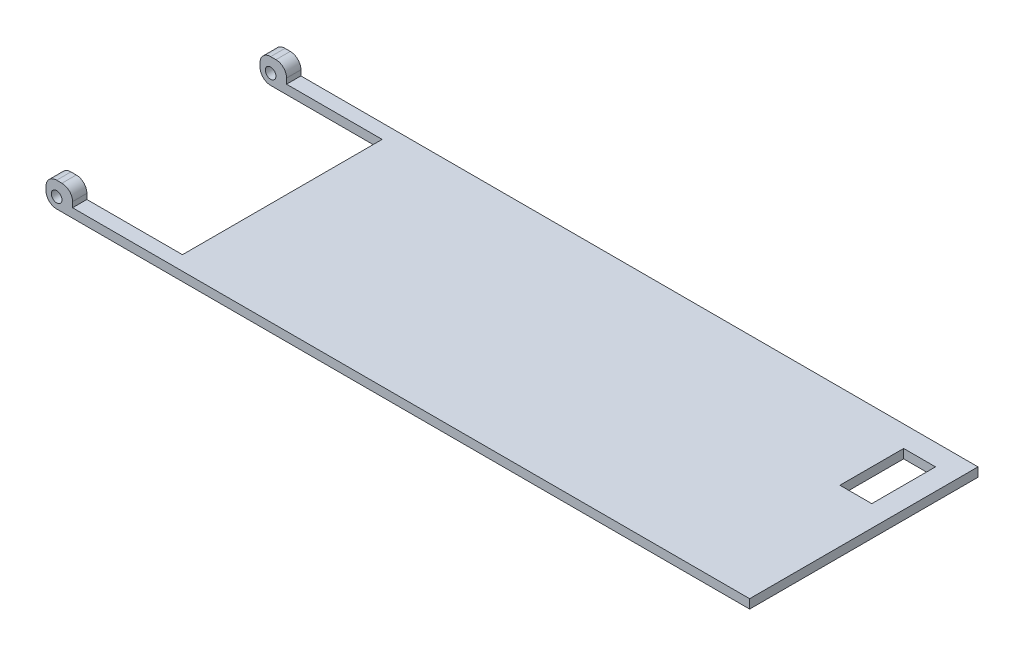
ISO-10303-21;
HEADER;
FILE_DESCRIPTION(('STEP AP214'),'2;1');
FILE_NAME('part.step','',(''),(''),'','','');
FILE_SCHEMA(('AUTOMOTIVE_DESIGN { 1 0 10303 214 1 1 1 1 }'));
ENDSEC;
DATA;
#1=APPLICATION_CONTEXT('core data for automotive mechanical design processes');
#2=APPLICATION_PROTOCOL_DEFINITION('international standard','automotive_design',2000,#1);
#3=PRODUCT_CONTEXT('',#1,'mechanical');
#4=PRODUCT('Part','Part','',(#3));
#5=PRODUCT_RELATED_PRODUCT_CATEGORY('part','',(#4));
#6=PRODUCT_DEFINITION_FORMATION('','',#4);
#7=PRODUCT_DEFINITION_CONTEXT('part definition',#1,'design');
#8=PRODUCT_DEFINITION('design','',#6,#7);
#9=PRODUCT_DEFINITION_SHAPE('','',#8);
#10=(LENGTH_UNIT() NAMED_UNIT(*) SI_UNIT(.MILLI.,.METRE.));
#11=(NAMED_UNIT(*) PLANE_ANGLE_UNIT() SI_UNIT($,.RADIAN.));
#12=(NAMED_UNIT(*) SI_UNIT($,.STERADIAN.) SOLID_ANGLE_UNIT());
#13=UNCERTAINTY_MEASURE_WITH_UNIT(LENGTH_MEASURE(1.E-05),#10,'distance_accuracy_value','');
#14=(GEOMETRIC_REPRESENTATION_CONTEXT(3) GLOBAL_UNCERTAINTY_ASSIGNED_CONTEXT((#13)) GLOBAL_UNIT_ASSIGNED_CONTEXT((#10,
#11,#12)) REPRESENTATION_CONTEXT('',''));
#15=CARTESIAN_POINT('',(0.,0.,0.));
#16=DIRECTION('',(0.,0.,1.));
#17=DIRECTION('',(1.,0.,0.));
#18=AXIS2_PLACEMENT_3D('',#15,#16,#17);
#19=CARTESIAN_POINT('',(0.,1.7,0.));
#20=DIRECTION('',(0.,-1.,0.));
#21=DIRECTION('',(0.,0.,-1.));
#22=AXIS2_PLACEMENT_3D('',#19,#20,#21);
#23=PLANE('',#22);
#24=DIRECTION('',(-1.,0.,0.));
#25=VECTOR('',#24,1.);
#26=CARTESIAN_POINT('',(56.25,1.7,-17.5));
#27=LINE('',#26,#25);
#28=CARTESIAN_POINT('',(62.25,1.7,-17.5));
#29=VERTEX_POINT('',#28);
#30=CARTESIAN_POINT('',(56.25,1.7,-17.5));
#31=VERTEX_POINT('',#30);
#32=EDGE_CURVE('E228',#29,#31,#27,.T.);
#33=ORIENTED_EDGE('',*,*,#32,.F.);
#34=DIRECTION('',(0.,0.,-1.));
#35=VECTOR('',#34,1.);
#36=CARTESIAN_POINT('',(62.25,1.7,-5.5));
#37=LINE('',#36,#35);
#38=CARTESIAN_POINT('',(62.25,1.7,-5.5));
#39=VERTEX_POINT('',#38);
#40=EDGE_CURVE('E61',#39,#29,#37,.T.);
#41=ORIENTED_EDGE('',*,*,#40,.F.);
#42=DIRECTION('',(1.,0.,0.));
#43=VECTOR('',#42,1.);
#44=CARTESIAN_POINT('',(56.25,1.7,-5.5));
#45=LINE('',#44,#43);
#46=CARTESIAN_POINT('',(56.25,1.7,-5.5));
#47=VERTEX_POINT('',#46);
#48=EDGE_CURVE('E215',#47,#39,#45,.T.);
#49=ORIENTED_EDGE('',*,*,#48,.F.);
#50=DIRECTION('',(0.,0.,1.));
#51=VECTOR('',#50,1.);
#52=CARTESIAN_POINT('',(56.25,1.7,-5.5));
#53=LINE('',#52,#51);
#54=EDGE_CURVE('E219',#31,#47,#53,.T.);
#55=ORIENTED_EDGE('',*,*,#54,.F.);
#56=EDGE_LOOP('',(#33,#41,#49,#55));
#57=FACE_BOUND('',#56,.T.);
#58=DIRECTION('',(-1.,0.,0.));
#59=VECTOR('',#58,1.);
#60=CARTESIAN_POINT('',(-66.25,1.7,-21.5));
#61=LINE('',#60,#59);
#62=CARTESIAN_POINT('',(66.25,1.7,-21.5));
#63=VERTEX_POINT('',#62);
#64=CARTESIAN_POINT('',(-61.25,1.7,-21.5));
#65=VERTEX_POINT('',#64);
#66=EDGE_CURVE('E336',#63,#65,#61,.T.);
#67=ORIENTED_EDGE('',*,*,#66,.T.);
#68=DIRECTION('',(0.,0.,1.));
#69=VECTOR('',#68,1.);
#70=CARTESIAN_POINT('',(-61.25,1.7,-18.8));
#71=LINE('',#70,#69);
#72=CARTESIAN_POINT('',(-61.25,1.7,-18.8));
#73=VERTEX_POINT('',#72);
#74=EDGE_CURVE('E247',#65,#73,#71,.T.);
#75=ORIENTED_EDGE('',*,*,#74,.T.);
#76=DIRECTION('',(-1.,0.,0.));
#77=VECTOR('',#76,1.);
#78=CARTESIAN_POINT('',(-66.25,1.7,-18.8));
#79=LINE('',#78,#77);
#80=CARTESIAN_POINT('',(-43.25,1.7,-18.8));
#81=VERTEX_POINT('',#80);
#82=EDGE_CURVE('E299',#81,#73,#79,.T.);
#83=ORIENTED_EDGE('',*,*,#82,.F.);
#84=DIRECTION('',(0.,0.,-1.));
#85=VECTOR('',#84,1.);
#86=CARTESIAN_POINT('',(-43.25,1.7,18.8));
#87=LINE('',#86,#85);
#88=CARTESIAN_POINT('',(-43.25,1.7,18.8));
#89=VERTEX_POINT('',#88);
#90=EDGE_CURVE('E310',#89,#81,#87,.T.);
#91=ORIENTED_EDGE('',*,*,#90,.F.);
#92=DIRECTION('',(1.,0.,0.));
#93=VECTOR('',#92,1.);
#94=CARTESIAN_POINT('',(-66.25,1.7,18.8));
#95=LINE('',#94,#93);
#96=CARTESIAN_POINT('',(-61.25,1.7,18.8));
#97=VERTEX_POINT('',#96);
#98=EDGE_CURVE('E294',#97,#89,#95,.T.);
#99=ORIENTED_EDGE('',*,*,#98,.F.);
#100=DIRECTION('',(0.,0.,-1.));
#101=VECTOR('',#100,1.);
#102=CARTESIAN_POINT('',(-61.25,1.7,18.8));
#103=LINE('',#102,#101);
#104=CARTESIAN_POINT('',(-61.25,1.7,21.5));
#105=VERTEX_POINT('',#104);
#106=EDGE_CURVE('E273',#105,#97,#103,.T.);
#107=ORIENTED_EDGE('',*,*,#106,.F.);
#108=DIRECTION('',(1.,0.,0.));
#109=VECTOR('',#108,1.);
#110=CARTESIAN_POINT('',(-66.25,1.7,21.5));
#111=LINE('',#110,#109);
#112=CARTESIAN_POINT('',(66.25,1.7,21.5));
#113=VERTEX_POINT('',#112);
#114=EDGE_CURVE('E341',#105,#113,#111,.T.);
#115=ORIENTED_EDGE('',*,*,#114,.T.);
#116=DIRECTION('',(0.,0.,-1.));
#117=VECTOR('',#116,1.);
#118=CARTESIAN_POINT('',(66.25,1.7,21.5));
#119=LINE('',#118,#117);
#120=EDGE_CURVE('E332',#113,#63,#119,.T.);
#121=ORIENTED_EDGE('',*,*,#120,.T.);
#122=EDGE_LOOP('',(#67,#75,#83,#91,#99,#107,#115,#121));
#123=FACE_BOUND('',#122,.T.);
#124=ADVANCED_FACE('F45',(#57,#123),#23,.F.);
#125=CARTESIAN_POINT('',(-66.25,1.7,21.5));
#126=DIRECTION('',(1.,0.,0.));
#127=DIRECTION('',(0.,0.,-1.));
#128=AXIS2_PLACEMENT_3D('',#125,#126,#127);
#129=PLANE('',#128);
#130=DIRECTION('',(0.,-1.,0.));
#131=VECTOR('',#130,1.);
#132=CARTESIAN_POINT('',(-66.25,1.7,-21.5));
#133=LINE('',#132,#131);
#134=CARTESIAN_POINT('',(-66.25,2.7,-21.5));
#135=VERTEX_POINT('',#134);
#136=CARTESIAN_POINT('',(-66.25,2.,-21.5));
#137=VERTEX_POINT('',#136);
#138=EDGE_CURVE('E361',#135,#137,#133,.T.);
#139=ORIENTED_EDGE('',*,*,#138,.T.);
#140=DIRECTION('',(0.,0.,1.));
#141=VECTOR('',#140,1.);
#142=CARTESIAN_POINT('',(-66.25,2.,-18.8));
#143=LINE('',#142,#141);
#144=CARTESIAN_POINT('',(-66.25,2.,-18.8));
#145=VERTEX_POINT('',#144);
#146=EDGE_CURVE('E412',#137,#145,#143,.T.);
#147=ORIENTED_EDGE('',*,*,#146,.T.);
#148=DIRECTION('',(0.,1.,0.));
#149=VECTOR('',#148,1.);
#150=CARTESIAN_POINT('',(-66.25,0.,-18.8));
#151=LINE('',#150,#149);
#152=CARTESIAN_POINT('',(-66.25,2.7,-18.8));
#153=VERTEX_POINT('',#152);
#154=EDGE_CURVE('E317',#145,#153,#151,.T.);
#155=ORIENTED_EDGE('',*,*,#154,.T.);
#156=DIRECTION('',(0.,0.,-1.));
#157=VECTOR('',#156,1.);
#158=CARTESIAN_POINT('',(-66.25,2.7,-21.5));
#159=LINE('',#158,#157);
#160=EDGE_CURVE('E408',#153,#135,#159,.T.);
#161=ORIENTED_EDGE('',*,*,#160,.T.);
#162=EDGE_LOOP('',(#139,#147,#155,#161));
#163=FACE_BOUND('',#162,.T.);
#164=ADVANCED_FACE('F456',(#163),#129,.F.);
#165=CARTESIAN_POINT('',(66.25,1.7,21.5));
#166=DIRECTION('',(-1.,0.,0.));
#167=DIRECTION('',(0.,0.,1.));
#168=AXIS2_PLACEMENT_3D('',#165,#166,#167);
#169=PLANE('',#168);
#170=DIRECTION('',(0.,0.,-1.));
#171=VECTOR('',#170,1.);
#172=CARTESIAN_POINT('',(66.25,0.,21.5));
#173=LINE('',#172,#171);
#174=CARTESIAN_POINT('',(66.25,0.,21.5));
#175=VERTEX_POINT('',#174);
#176=CARTESIAN_POINT('',(66.25,0.,-21.5));
#177=VERTEX_POINT('',#176);
#178=EDGE_CURVE('E321',#175,#177,#173,.T.);
#179=ORIENTED_EDGE('',*,*,#178,.T.);
#180=DIRECTION('',(0.,-1.,0.));
#181=VECTOR('',#180,1.);
#182=CARTESIAN_POINT('',(66.25,1.7,-21.5));
#183=LINE('',#182,#181);
#184=EDGE_CURVE('E365',#63,#177,#183,.T.);
#185=ORIENTED_EDGE('',*,*,#184,.F.);
#186=ORIENTED_EDGE('',*,*,#120,.F.);
#187=DIRECTION('',(0.,-1.,0.));
#188=VECTOR('',#187,1.);
#189=CARTESIAN_POINT('',(66.25,1.7,21.5));
#190=LINE('',#189,#188);
#191=EDGE_CURVE('E344',#113,#175,#190,.T.);
#192=ORIENTED_EDGE('',*,*,#191,.T.);
#193=EDGE_LOOP('',(#179,#185,#186,#192));
#194=FACE_BOUND('',#193,.T.);
#195=ADVANCED_FACE('F512',(#194),#169,.F.);
#196=CARTESIAN_POINT('',(-66.25,1.7,-21.5));
#197=DIRECTION('',(0.,0.,1.));
#198=DIRECTION('',(1.,0.,0.));
#199=AXIS2_PLACEMENT_3D('',#196,#197,#198);
#200=PLANE('',#199);
#201=CARTESIAN_POINT('',(-64.25,2.,-21.5));
#202=DIRECTION('',(0.,0.,1.));
#203=DIRECTION('',(1.,0.,0.));
#204=AXIS2_PLACEMENT_3D('',#201,#202,#203);
#205=CIRCLE('',#204,0.999999999999998);
#206=CARTESIAN_POINT('',(-65.25,2.,-21.5));
#207=VERTEX_POINT('',#206);
#208=EDGE_CURVE('E237',#207,#207,#205,.T.);
#209=ORIENTED_EDGE('',*,*,#208,.T.);
#210=EDGE_LOOP('',(#209));
#211=FACE_BOUND('',#210,.T.);
#212=DIRECTION('',(-1.,0.,0.));
#213=VECTOR('',#212,1.);
#214=CARTESIAN_POINT('',(-66.25,0.,-21.5));
#215=LINE('',#214,#213);
#216=CARTESIAN_POINT('',(-64.25,0.,-21.5));
#217=VERTEX_POINT('',#216);
#218=EDGE_CURVE('E348',#177,#217,#215,.T.);
#219=ORIENTED_EDGE('',*,*,#218,.T.);
#220=CARTESIAN_POINT('',(-64.25,2.,-21.5));
#221=DIRECTION('',(0.,0.,1.));
#222=DIRECTION('',(1.,0.,0.));
#223=AXIS2_PLACEMENT_3D('',#220,#221,#222);
#224=CIRCLE('',#223,2.);
#225=EDGE_CURVE('E434',#217,#137,#224,.F.);
#226=ORIENTED_EDGE('',*,*,#225,.T.);
#227=ORIENTED_EDGE('',*,*,#138,.F.);
#228=CARTESIAN_POINT('',(-64.25,2.7,-21.5));
#229=DIRECTION('',(0.,0.,1.));
#230=DIRECTION('',(1.,0.,0.));
#231=AXIS2_PLACEMENT_3D('',#228,#229,#230);
#232=CIRCLE('',#231,2.);
#233=CARTESIAN_POINT('',(-64.25,4.7,-21.5));
#234=VERTEX_POINT('',#233);
#235=EDGE_CURVE('E428',#135,#234,#232,.F.);
#236=ORIENTED_EDGE('',*,*,#235,.T.);
#237=DIRECTION('',(1.,0.,0.));
#238=VECTOR('',#237,1.);
#239=CARTESIAN_POINT('',(-66.25,4.7,-21.5));
#240=LINE('',#239,#238);
#241=CARTESIAN_POINT('',(-63.25,4.7,-21.5));
#242=VERTEX_POINT('',#241);
#243=EDGE_CURVE('E255',#234,#242,#240,.T.);
#244=ORIENTED_EDGE('',*,*,#243,.T.);
#245=CARTESIAN_POINT('',(-63.25,2.7,-21.5));
#246=DIRECTION('',(0.,0.,1.));
#247=DIRECTION('',(1.,0.,0.));
#248=AXIS2_PLACEMENT_3D('',#245,#246,#247);
#249=CIRCLE('',#248,2.);
#250=CARTESIAN_POINT('',(-61.25,2.7,-21.5));
#251=VERTEX_POINT('',#250);
#252=EDGE_CURVE('E431',#242,#251,#249,.F.);
#253=ORIENTED_EDGE('',*,*,#252,.T.);
#254=DIRECTION('',(0.,-1.,0.));
#255=VECTOR('',#254,1.);
#256=CARTESIAN_POINT('',(-61.25,4.7,-21.5));
#257=LINE('',#256,#255);
#258=EDGE_CURVE('E259',#251,#65,#257,.T.);
#259=ORIENTED_EDGE('',*,*,#258,.T.);
#260=ORIENTED_EDGE('',*,*,#66,.F.);
#261=ORIENTED_EDGE('',*,*,#184,.T.);
#262=EDGE_LOOP('',(#219,#226,#227,#236,#244,#253,#259,#260,#261));
#263=FACE_BOUND('',#262,.T.);
#264=ADVANCED_FACE('F459',(#211,#263),#200,.F.);
#265=DIRECTION('',(0.,1.,0.));
#266=VECTOR('',#265,1.);
#267=CARTESIAN_POINT('',(-66.25,0.,18.8));
#268=LINE('',#267,#266);
#269=CARTESIAN_POINT('',(-66.25,2.,18.8));
#270=VERTEX_POINT('',#269);
#271=CARTESIAN_POINT('',(-66.25,2.7,18.8));
#272=VERTEX_POINT('',#271);
#273=EDGE_CURVE('E307',#270,#272,#268,.T.);
#274=ORIENTED_EDGE('',*,*,#273,.F.);
#275=DIRECTION('',(0.,0.,1.));
#276=VECTOR('',#275,1.);
#277=CARTESIAN_POINT('',(-66.25,2.,21.5));
#278=LINE('',#277,#276);
#279=CARTESIAN_POINT('',(-66.25,2.,21.5));
#280=VERTEX_POINT('',#279);
#281=EDGE_CURVE('E372',#270,#280,#278,.T.);
#282=ORIENTED_EDGE('',*,*,#281,.T.);
#283=DIRECTION('',(0.,-1.,0.));
#284=VECTOR('',#283,1.);
#285=CARTESIAN_POINT('',(-66.25,1.7,21.5));
#286=LINE('',#285,#284);
#287=CARTESIAN_POINT('',(-66.25,2.7,21.5));
#288=VERTEX_POINT('',#287);
#289=EDGE_CURVE('E357',#288,#280,#286,.T.);
#290=ORIENTED_EDGE('',*,*,#289,.F.);
#291=DIRECTION('',(0.,0.,1.));
#292=VECTOR('',#291,1.);
#293=CARTESIAN_POINT('',(-66.25,2.7,18.8));
#294=LINE('',#293,#292);
#295=EDGE_CURVE('E369',#288,#272,#294,.F.);
#296=ORIENTED_EDGE('',*,*,#295,.T.);
#297=EDGE_LOOP('',(#274,#282,#290,#296));
#298=FACE_BOUND('',#297,.T.);
#299=ADVANCED_FACE('F503',(#298),#129,.F.);
#300=CARTESIAN_POINT('',(-66.25,1.7,21.5));
#301=DIRECTION('',(0.,0.,-1.));
#302=DIRECTION('',(-1.,0.,0.));
#303=AXIS2_PLACEMENT_3D('',#300,#301,#302);
#304=PLANE('',#303);
#305=CARTESIAN_POINT('',(-64.25,2.,21.5));
#306=DIRECTION('',(0.,0.,1.));
#307=DIRECTION('',(1.,0.,0.));
#308=AXIS2_PLACEMENT_3D('',#305,#306,#307);
#309=CIRCLE('',#308,0.999999999999998);
#310=CARTESIAN_POINT('',(-63.25,2.,21.5));
#311=VERTEX_POINT('',#310);
#312=EDGE_CURVE('E268',#311,#311,#309,.T.);
#313=ORIENTED_EDGE('',*,*,#312,.F.);
#314=EDGE_LOOP('',(#313));
#315=FACE_BOUND('',#314,.T.);
#316=ORIENTED_EDGE('',*,*,#289,.T.);
#317=CARTESIAN_POINT('',(-64.25,2.,21.5));
#318=DIRECTION('',(0.,0.,-1.));
#319=DIRECTION('',(-1.,0.,0.));
#320=AXIS2_PLACEMENT_3D('',#317,#318,#319);
#321=CIRCLE('',#320,2.);
#322=CARTESIAN_POINT('',(-64.25,0.,21.5));
#323=VERTEX_POINT('',#322);
#324=EDGE_CURVE('E382',#280,#323,#321,.F.);
#325=ORIENTED_EDGE('',*,*,#324,.T.);
#326=DIRECTION('',(1.,0.,0.));
#327=VECTOR('',#326,1.);
#328=CARTESIAN_POINT('',(-66.25,0.,21.5));
#329=LINE('',#328,#327);
#330=EDGE_CURVE('E337',#323,#175,#329,.T.);
#331=ORIENTED_EDGE('',*,*,#330,.T.);
#332=ORIENTED_EDGE('',*,*,#191,.F.);
#333=ORIENTED_EDGE('',*,*,#114,.F.);
#334=DIRECTION('',(0.,-1.,0.));
#335=VECTOR('',#334,1.);
#336=CARTESIAN_POINT('',(-61.25,4.7,21.5));
#337=LINE('',#336,#335);
#338=CARTESIAN_POINT('',(-61.25,2.7,21.5));
#339=VERTEX_POINT('',#338);
#340=EDGE_CURVE('E291',#339,#105,#337,.T.);
#341=ORIENTED_EDGE('',*,*,#340,.F.);
#342=CARTESIAN_POINT('',(-63.25,2.7,21.5));
#343=DIRECTION('',(0.,0.,-1.));
#344=DIRECTION('',(-1.,0.,0.));
#345=AXIS2_PLACEMENT_3D('',#342,#343,#344);
#346=CIRCLE('',#345,2.);
#347=CARTESIAN_POINT('',(-63.25,4.7,21.5));
#348=VERTEX_POINT('',#347);
#349=EDGE_CURVE('E379',#339,#348,#346,.F.);
#350=ORIENTED_EDGE('',*,*,#349,.T.);
#351=DIRECTION('',(1.,0.,0.));
#352=VECTOR('',#351,1.);
#353=CARTESIAN_POINT('',(-66.25,4.7,21.5));
#354=LINE('',#353,#352);
#355=CARTESIAN_POINT('',(-64.25,4.7,21.5));
#356=VERTEX_POINT('',#355);
#357=EDGE_CURVE('E277',#356,#348,#354,.T.);
#358=ORIENTED_EDGE('',*,*,#357,.F.);
#359=CARTESIAN_POINT('',(-64.25,2.7,21.5));
#360=DIRECTION('',(0.,0.,-1.));
#361=DIRECTION('',(-1.,0.,0.));
#362=AXIS2_PLACEMENT_3D('',#359,#360,#361);
#363=CIRCLE('',#362,2.);
#364=EDGE_CURVE('E376',#356,#288,#363,.F.);
#365=ORIENTED_EDGE('',*,*,#364,.T.);
#366=EDGE_LOOP('',(#316,#325,#331,#332,#333,#341,#350,#358,#365));
#367=FACE_BOUND('',#366,.T.);
#368=ADVANCED_FACE('F486',(#315,#367),#304,.F.);
#369=CARTESIAN_POINT('',(0.,0.,0.));
#370=DIRECTION('',(0.,-1.,0.));
#371=DIRECTION('',(0.,0.,-1.));
#372=AXIS2_PLACEMENT_3D('',#369,#370,#371);
#373=PLANE('',#372);
#374=DIRECTION('',(0.,0.,-1.));
#375=VECTOR('',#374,1.);
#376=CARTESIAN_POINT('',(62.25,0.,-5.5));
#377=LINE('',#376,#375);
#378=CARTESIAN_POINT('',(62.25,0.,-5.5));
#379=VERTEX_POINT('',#378);
#380=CARTESIAN_POINT('',(62.25,0.,-17.5));
#381=VERTEX_POINT('',#380);
#382=EDGE_CURVE('E196',#379,#381,#377,.T.);
#383=ORIENTED_EDGE('',*,*,#382,.T.);
#384=DIRECTION('',(-1.,0.,0.));
#385=VECTOR('',#384,1.);
#386=CARTESIAN_POINT('',(56.25,0.,-17.5));
#387=LINE('',#386,#385);
#388=CARTESIAN_POINT('',(56.25,0.,-17.5));
#389=VERTEX_POINT('',#388);
#390=EDGE_CURVE('E206',#381,#389,#387,.T.);
#391=ORIENTED_EDGE('',*,*,#390,.T.);
#392=DIRECTION('',(0.,0.,1.));
#393=VECTOR('',#392,1.);
#394=CARTESIAN_POINT('',(56.25,0.,-5.5));
#395=LINE('',#394,#393);
#396=CARTESIAN_POINT('',(56.25,0.,-5.5));
#397=VERTEX_POINT('',#396);
#398=EDGE_CURVE('E69',#389,#397,#395,.T.);
#399=ORIENTED_EDGE('',*,*,#398,.T.);
#400=DIRECTION('',(1.,0.,0.));
#401=VECTOR('',#400,1.);
#402=CARTESIAN_POINT('',(56.25,0.,-5.5));
#403=LINE('',#402,#401);
#404=EDGE_CURVE('E203',#397,#379,#403,.T.);
#405=ORIENTED_EDGE('',*,*,#404,.T.);
#406=EDGE_LOOP('',(#383,#391,#399,#405));
#407=FACE_BOUND('',#406,.T.);
#408=DIRECTION('',(-1.,0.,0.));
#409=VECTOR('',#408,1.);
#410=CARTESIAN_POINT('',(-66.25,0.,-18.8));
#411=LINE('',#410,#409);
#412=CARTESIAN_POINT('',(-43.25,0.,-18.8));
#413=VERTEX_POINT('',#412);
#414=CARTESIAN_POINT('',(-64.25,0.,-18.8));
#415=VERTEX_POINT('',#414);
#416=EDGE_CURVE('E303',#413,#415,#411,.T.);
#417=ORIENTED_EDGE('',*,*,#416,.T.);
#418=DIRECTION('',(0.,0.,1.));
#419=VECTOR('',#418,1.);
#420=CARTESIAN_POINT('',(-64.25,0.,-21.5));
#421=LINE('',#420,#419);
#422=EDGE_CURVE('E425',#415,#217,#421,.F.);
#423=ORIENTED_EDGE('',*,*,#422,.T.);
#424=ORIENTED_EDGE('',*,*,#218,.F.);
#425=ORIENTED_EDGE('',*,*,#178,.F.);
#426=ORIENTED_EDGE('',*,*,#330,.F.);
#427=DIRECTION('',(0.,0.,1.));
#428=VECTOR('',#427,1.);
#429=CARTESIAN_POINT('',(-64.25,0.,18.8));
#430=LINE('',#429,#428);
#431=CARTESIAN_POINT('',(-64.25,0.,18.8));
#432=VERTEX_POINT('',#431);
#433=EDGE_CURVE('E385',#323,#432,#430,.F.);
#434=ORIENTED_EDGE('',*,*,#433,.T.);
#435=DIRECTION('',(1.,0.,0.));
#436=VECTOR('',#435,1.);
#437=CARTESIAN_POINT('',(-66.25,0.,18.8));
#438=LINE('',#437,#436);
#439=CARTESIAN_POINT('',(-43.25,0.,18.8));
#440=VERTEX_POINT('',#439);
#441=EDGE_CURVE('E295',#432,#440,#438,.T.);
#442=ORIENTED_EDGE('',*,*,#441,.T.);
#443=DIRECTION('',(0.,0.,-1.));
#444=VECTOR('',#443,1.);
#445=CARTESIAN_POINT('',(-43.25,0.,18.8));
#446=LINE('',#445,#444);
#447=EDGE_CURVE('E298',#440,#413,#446,.T.);
#448=ORIENTED_EDGE('',*,*,#447,.T.);
#449=EDGE_LOOP('',(#417,#423,#424,#425,#426,#434,#442,#448));
#450=FACE_BOUND('',#449,.T.);
#451=ADVANCED_FACE('F211',(#407,#450),#373,.T.);
#452=CARTESIAN_POINT('',(-66.25,0.,-18.8));
#453=DIRECTION('',(0.,0.,-1.));
#454=DIRECTION('',(-1.,0.,0.));
#455=AXIS2_PLACEMENT_3D('',#452,#453,#454);
#456=PLANE('',#455);
#457=CARTESIAN_POINT('',(-64.25,2.,-18.8));
#458=DIRECTION('',(0.,0.,1.));
#459=DIRECTION('',(1.,0.,0.));
#460=AXIS2_PLACEMENT_3D('',#457,#458,#459);
#461=CIRCLE('',#460,0.999999999999998);
#462=CARTESIAN_POINT('',(-65.25,2.,-18.8));
#463=VERTEX_POINT('',#462);
#464=EDGE_CURVE('E243',#463,#463,#461,.T.);
#465=ORIENTED_EDGE('',*,*,#464,.F.);
#466=EDGE_LOOP('',(#465));
#467=FACE_BOUND('',#466,.T.);
#468=ORIENTED_EDGE('',*,*,#154,.F.);
#469=CARTESIAN_POINT('',(-64.25,2.,-18.8));
#470=DIRECTION('',(0.,0.,-1.));
#471=DIRECTION('',(-1.,0.,0.));
#472=AXIS2_PLACEMENT_3D('',#469,#470,#471);
#473=CIRCLE('',#472,2.);
#474=EDGE_CURVE('E422',#145,#415,#473,.F.);
#475=ORIENTED_EDGE('',*,*,#474,.T.);
#476=ORIENTED_EDGE('',*,*,#416,.F.);
#477=DIRECTION('',(0.,1.,0.));
#478=VECTOR('',#477,1.);
#479=CARTESIAN_POINT('',(-43.25,0.,-18.8));
#480=LINE('',#479,#478);
#481=EDGE_CURVE('E322',#413,#81,#480,.T.);
#482=ORIENTED_EDGE('',*,*,#481,.T.);
#483=ORIENTED_EDGE('',*,*,#82,.T.);
#484=DIRECTION('',(0.,-1.,0.));
#485=VECTOR('',#484,1.);
#486=CARTESIAN_POINT('',(-61.25,4.7,-18.8));
#487=LINE('',#486,#485);
#488=CARTESIAN_POINT('',(-61.25,2.7,-18.8));
#489=VERTEX_POINT('',#488);
#490=EDGE_CURVE('E265',#489,#73,#487,.T.);
#491=ORIENTED_EDGE('',*,*,#490,.F.);
#492=CARTESIAN_POINT('',(-63.25,2.7,-18.8));
#493=DIRECTION('',(0.,0.,-1.));
#494=DIRECTION('',(-1.,0.,0.));
#495=AXIS2_PLACEMENT_3D('',#492,#493,#494);
#496=CIRCLE('',#495,2.);
#497=CARTESIAN_POINT('',(-63.25,4.7,-18.8));
#498=VERTEX_POINT('',#497);
#499=EDGE_CURVE('E419',#489,#498,#496,.F.);
#500=ORIENTED_EDGE('',*,*,#499,.T.);
#501=DIRECTION('',(-1.,0.,0.));
#502=VECTOR('',#501,1.);
#503=CARTESIAN_POINT('',(-66.25,4.7,-18.8));
#504=LINE('',#503,#502);
#505=CARTESIAN_POINT('',(-64.25,4.7,-18.8));
#506=VERTEX_POINT('',#505);
#507=EDGE_CURVE('E251',#498,#506,#504,.T.);
#508=ORIENTED_EDGE('',*,*,#507,.T.);
#509=CARTESIAN_POINT('',(-64.25,2.7,-18.8));
#510=DIRECTION('',(0.,0.,-1.));
#511=DIRECTION('',(-1.,0.,0.));
#512=AXIS2_PLACEMENT_3D('',#509,#510,#511);
#513=CIRCLE('',#512,2.);
#514=EDGE_CURVE('E416',#506,#153,#513,.F.);
#515=ORIENTED_EDGE('',*,*,#514,.T.);
#516=EDGE_LOOP('',(#468,#475,#476,#482,#483,#491,#500,#508,#515));
#517=FACE_BOUND('',#516,.T.);
#518=ADVANCED_FACE('F451',(#467,#517),#456,.F.);
#519=CARTESIAN_POINT('',(-43.25,0.,18.8));
#520=DIRECTION('',(1.,0.,0.));
#521=DIRECTION('',(0.,0.,-1.));
#522=AXIS2_PLACEMENT_3D('',#519,#520,#521);
#523=PLANE('',#522);
#524=ORIENTED_EDGE('',*,*,#90,.T.);
#525=ORIENTED_EDGE('',*,*,#481,.F.);
#526=ORIENTED_EDGE('',*,*,#447,.F.);
#527=DIRECTION('',(0.,1.,0.));
#528=VECTOR('',#527,1.);
#529=CARTESIAN_POINT('',(-43.25,0.,18.8));
#530=LINE('',#529,#528);
#531=EDGE_CURVE('E325',#440,#89,#530,.T.);
#532=ORIENTED_EDGE('',*,*,#531,.T.);
#533=EDGE_LOOP('',(#524,#525,#526,#532));
#534=FACE_BOUND('',#533,.T.);
#535=ADVANCED_FACE('F469',(#534),#523,.F.);
#536=CARTESIAN_POINT('',(-66.25,0.,18.8));
#537=DIRECTION('',(0.,0.,1.));
#538=DIRECTION('',(1.,0.,0.));
#539=AXIS2_PLACEMENT_3D('',#536,#537,#538);
#540=PLANE('',#539);
#541=CARTESIAN_POINT('',(-64.25,2.,18.8));
#542=DIRECTION('',(0.,0.,1.));
#543=DIRECTION('',(1.,0.,0.));
#544=AXIS2_PLACEMENT_3D('',#541,#542,#543);
#545=CIRCLE('',#544,0.999999999999998);
#546=CARTESIAN_POINT('',(-63.25,2.,18.8));
#547=VERTEX_POINT('',#546);
#548=EDGE_CURVE('E269',#547,#547,#545,.T.);
#549=ORIENTED_EDGE('',*,*,#548,.T.);
#550=EDGE_LOOP('',(#549));
#551=FACE_BOUND('',#550,.T.);
#552=ORIENTED_EDGE('',*,*,#441,.F.);
#553=CARTESIAN_POINT('',(-64.25,2.,18.8));
#554=DIRECTION('',(0.,0.,1.));
#555=DIRECTION('',(1.,0.,0.));
#556=AXIS2_PLACEMENT_3D('',#553,#554,#555);
#557=CIRCLE('',#556,2.);
#558=EDGE_CURVE('E394',#432,#270,#557,.F.);
#559=ORIENTED_EDGE('',*,*,#558,.T.);
#560=ORIENTED_EDGE('',*,*,#273,.T.);
#561=CARTESIAN_POINT('',(-64.25,2.7,18.8));
#562=DIRECTION('',(0.,0.,1.));
#563=DIRECTION('',(1.,0.,0.));
#564=AXIS2_PLACEMENT_3D('',#561,#562,#563);
#565=CIRCLE('',#564,2.);
#566=CARTESIAN_POINT('',(-64.25,4.7,18.8));
#567=VERTEX_POINT('',#566);
#568=EDGE_CURVE('E388',#272,#567,#565,.F.);
#569=ORIENTED_EDGE('',*,*,#568,.T.);
#570=DIRECTION('',(-1.,0.,0.));
#571=VECTOR('',#570,1.);
#572=CARTESIAN_POINT('',(-66.25,4.7,18.8));
#573=LINE('',#572,#571);
#574=CARTESIAN_POINT('',(-63.25,4.7,18.8));
#575=VERTEX_POINT('',#574);
#576=EDGE_CURVE('E281',#575,#567,#573,.T.);
#577=ORIENTED_EDGE('',*,*,#576,.F.);
#578=CARTESIAN_POINT('',(-63.25,2.7,18.8));
#579=DIRECTION('',(0.,0.,1.));
#580=DIRECTION('',(1.,0.,0.));
#581=AXIS2_PLACEMENT_3D('',#578,#579,#580);
#582=CIRCLE('',#581,2.);
#583=CARTESIAN_POINT('',(-61.25,2.7,18.8));
#584=VERTEX_POINT('',#583);
#585=EDGE_CURVE('E391',#575,#584,#582,.F.);
#586=ORIENTED_EDGE('',*,*,#585,.T.);
#587=DIRECTION('',(0.,-1.,0.));
#588=VECTOR('',#587,1.);
#589=CARTESIAN_POINT('',(-61.25,4.7,18.8));
#590=LINE('',#589,#588);
#591=EDGE_CURVE('E285',#584,#97,#590,.T.);
#592=ORIENTED_EDGE('',*,*,#591,.T.);
#593=ORIENTED_EDGE('',*,*,#98,.T.);
#594=ORIENTED_EDGE('',*,*,#531,.F.);
#595=EDGE_LOOP('',(#552,#559,#560,#569,#577,#586,#592,#593,#594));
#596=FACE_BOUND('',#595,.T.);
#597=ADVANCED_FACE('F472',(#551,#596),#540,.F.);
#598=CARTESIAN_POINT('',(-61.25,4.7,18.8));
#599=DIRECTION('',(-1.,0.,0.));
#600=DIRECTION('',(0.,0.,1.));
#601=AXIS2_PLACEMENT_3D('',#598,#599,#600);
#602=PLANE('',#601);
#603=ORIENTED_EDGE('',*,*,#591,.F.);
#604=DIRECTION('',(0.,0.,-1.));
#605=VECTOR('',#604,1.);
#606=CARTESIAN_POINT('',(-61.25,2.7,21.5));
#607=LINE('',#606,#605);
#608=EDGE_CURVE('E405',#584,#339,#607,.F.);
#609=ORIENTED_EDGE('',*,*,#608,.T.);
#610=ORIENTED_EDGE('',*,*,#340,.T.);
#611=ORIENTED_EDGE('',*,*,#106,.T.);
#612=EDGE_LOOP('',(#603,#609,#610,#611));
#613=FACE_BOUND('',#612,.T.);
#614=ADVANCED_FACE('F481',(#613),#602,.F.);
#615=CARTESIAN_POINT('',(0.,4.7,0.));
#616=DIRECTION('',(0.,1.,0.));
#617=DIRECTION('',(0.,0.,1.));
#618=AXIS2_PLACEMENT_3D('',#615,#616,#617);
#619=PLANE('',#618);
#620=ORIENTED_EDGE('',*,*,#357,.T.);
#621=DIRECTION('',(0.,0.,-1.));
#622=VECTOR('',#621,1.);
#623=CARTESIAN_POINT('',(-63.25,4.7,18.8));
#624=LINE('',#623,#622);
#625=EDGE_CURVE('E401',#348,#575,#624,.T.);
#626=ORIENTED_EDGE('',*,*,#625,.T.);
#627=ORIENTED_EDGE('',*,*,#576,.T.);
#628=DIRECTION('',(0.,0.,1.));
#629=VECTOR('',#628,1.);
#630=CARTESIAN_POINT('',(-64.25,4.7,21.5));
#631=LINE('',#630,#629);
#632=EDGE_CURVE('E397',#567,#356,#631,.T.);
#633=ORIENTED_EDGE('',*,*,#632,.T.);
#634=EDGE_LOOP('',(#620,#626,#627,#633));
#635=FACE_BOUND('',#634,.T.);
#636=ADVANCED_FACE('F494',(#635),#619,.T.);
#637=CARTESIAN_POINT('',(-64.25,2.,18.8));
#638=DIRECTION('',(0.,0.,1.));
#639=DIRECTION('',(1.,0.,0.));
#640=AXIS2_PLACEMENT_3D('',#637,#638,#639);
#641=CYLINDRICAL_SURFACE('',#640,0.999999999999998);
#642=CARTESIAN_POINT('',(-63.25,2.,18.8));
#643=CARTESIAN_POINT('',(-63.25,2.,18.828125));
#644=CARTESIAN_POINT('',(-63.25,2.,18.85625));
#645=CARTESIAN_POINT('',(-63.25,2.,18.9125));
#646=CARTESIAN_POINT('',(-63.25,2.,18.940625));
#647=CARTESIAN_POINT('',(-63.25,2.,18.996875));
#648=CARTESIAN_POINT('',(-63.25,2.,19.025));
#649=CARTESIAN_POINT('',(-63.25,2.,19.08125));
#650=CARTESIAN_POINT('',(-63.25,2.,19.109375));
#651=CARTESIAN_POINT('',(-63.25,2.,19.165625));
#652=CARTESIAN_POINT('',(-63.25,2.,19.19375));
#653=CARTESIAN_POINT('',(-63.25,2.,19.25));
#654=CARTESIAN_POINT('',(-63.25,2.,19.278125));
#655=CARTESIAN_POINT('',(-63.25,2.,19.334375));
#656=CARTESIAN_POINT('',(-63.25,2.,19.3625));
#657=CARTESIAN_POINT('',(-63.25,2.,19.41875));
#658=CARTESIAN_POINT('',(-63.25,2.,19.446875));
#659=CARTESIAN_POINT('',(-63.25,2.,19.503125));
#660=CARTESIAN_POINT('',(-63.25,2.,19.53125));
#661=CARTESIAN_POINT('',(-63.25,2.,19.5875));
#662=CARTESIAN_POINT('',(-63.25,2.,19.615625));
#663=CARTESIAN_POINT('',(-63.25,2.,19.671875));
#664=CARTESIAN_POINT('',(-63.25,2.,19.7));
#665=CARTESIAN_POINT('',(-63.25,2.,19.75625));
#666=CARTESIAN_POINT('',(-63.25,2.,19.784375));
#667=CARTESIAN_POINT('',(-63.25,2.,19.840625));
#668=CARTESIAN_POINT('',(-63.25,2.,19.86875));
#669=CARTESIAN_POINT('',(-63.25,2.,19.925));
#670=CARTESIAN_POINT('',(-63.25,2.,19.953125));
#671=CARTESIAN_POINT('',(-63.25,2.,20.009375));
#672=CARTESIAN_POINT('',(-63.25,2.,20.0375));
#673=CARTESIAN_POINT('',(-63.25,2.,20.09375));
#674=CARTESIAN_POINT('',(-63.25,2.,20.121875));
#675=CARTESIAN_POINT('',(-63.25,2.,20.178125));
#676=CARTESIAN_POINT('',(-63.25,2.,20.20625));
#677=CARTESIAN_POINT('',(-63.25,2.,20.2625));
#678=CARTESIAN_POINT('',(-63.25,2.,20.290625));
#679=CARTESIAN_POINT('',(-63.25,2.,20.346875));
#680=CARTESIAN_POINT('',(-63.25,2.,20.375));
#681=CARTESIAN_POINT('',(-63.25,2.,20.43125));
#682=CARTESIAN_POINT('',(-63.25,2.,20.459375));
#683=CARTESIAN_POINT('',(-63.25,2.,20.515625));
#684=CARTESIAN_POINT('',(-63.25,2.,20.54375));
#685=CARTESIAN_POINT('',(-63.25,2.,20.6));
#686=CARTESIAN_POINT('',(-63.25,2.,20.628125));
#687=CARTESIAN_POINT('',(-63.25,2.,20.684375));
#688=CARTESIAN_POINT('',(-63.25,2.,20.7125));
#689=CARTESIAN_POINT('',(-63.25,2.,20.76875));
#690=CARTESIAN_POINT('',(-63.25,2.,20.796875));
#691=CARTESIAN_POINT('',(-63.25,2.,20.853125));
#692=CARTESIAN_POINT('',(-63.25,2.,20.88125));
#693=CARTESIAN_POINT('',(-63.25,2.,20.9375));
#694=CARTESIAN_POINT('',(-63.25,2.,20.965625));
#695=CARTESIAN_POINT('',(-63.25,2.,21.021875));
#696=CARTESIAN_POINT('',(-63.25,2.,21.05));
#697=CARTESIAN_POINT('',(-63.25,2.,21.10625));
#698=CARTESIAN_POINT('',(-63.25,2.,21.134375));
#699=CARTESIAN_POINT('',(-63.25,2.,21.190625));
#700=CARTESIAN_POINT('',(-63.25,2.,21.21875));
#701=CARTESIAN_POINT('',(-63.25,2.,21.275));
#702=CARTESIAN_POINT('',(-63.25,2.,21.303125));
#703=CARTESIAN_POINT('',(-63.25,2.,21.359375));
#704=CARTESIAN_POINT('',(-63.25,2.,21.3875));
#705=CARTESIAN_POINT('',(-63.25,2.,21.44375));
#706=CARTESIAN_POINT('',(-63.25,2.,21.471875));
#707=CARTESIAN_POINT('',(-63.25,2.,21.5));
#708=B_SPLINE_CURVE_WITH_KNOTS('',3,(#642,#643,#644,#645,#646,#647,#648,#649,#650,#651,#652,
#653,#654,#655,#656,#657,#658,#659,#660,#661,#662,#663,#664,#665,#666,#667,#668,#669,#670,#671,
#672,#673,#674,#675,#676,#677,#678,#679,#680,#681,#682,#683,#684,#685,#686,#687,#688,#689,#690,
#691,#692,#693,#694,#695,#696,#697,#698,#699,#700,#701,#702,#703,#704,#705,#706,#707),
.UNSPECIFIED.,.F.,.F.,(4,2,2,2,2,2,2,2,2,2,2,2,2,2,2,2,2,2,2,2,2,2,2,2,2,2,2,2,2,2,2,2,4),(0.,
0.0843750000000011,0.168750000000002,0.253125000000003,0.337500000000001,0.421875000000002,
0.506250000000003,0.590625000000001,0.675000000000002,0.759375000000003,0.843750000000001,
0.928125000000002,1.0125,1.096875,1.18125,1.265625,1.35,1.434375,1.51875,1.603125,1.6875,
1.771875,1.85625,1.940625,2.025,2.109375,2.19375,2.278125,2.3625,2.446875,2.53125,2.615625,2.7),.UNSPECIFIED.);
#709=EDGE_CURVE('BSEAM552',#547,#311,#708,.T.);
#710=ORIENTED_EDGE('',*,*,#548,.F.);
#711=ORIENTED_EDGE('',*,*,#312,.T.);
#712=ORIENTED_EDGE('',*,*,#709,.T.);
#713=ORIENTED_EDGE('',*,*,#709,.F.);
#714=EDGE_LOOP('',(#710,#712,#711,#713));
#715=FACE_BOUND('',#714,.T.);
#716=ADVANCED_FACE('F552',(#715),#641,.F.);
#717=CARTESIAN_POINT('',(-64.25,2.,21.5));
#718=DIRECTION('',(0.,0.,-1.));
#719=DIRECTION('',(-1.,0.,0.));
#720=AXIS2_PLACEMENT_3D('',#717,#718,#719);
#721=CYLINDRICAL_SURFACE('',#720,2.);
#722=ORIENTED_EDGE('',*,*,#558,.F.);
#723=ORIENTED_EDGE('',*,*,#433,.F.);
#724=ORIENTED_EDGE('',*,*,#324,.F.);
#725=ORIENTED_EDGE('',*,*,#281,.F.);
#726=EDGE_LOOP('',(#722,#723,#724,#725));
#727=FACE_BOUND('',#726,.T.);
#728=ADVANCED_FACE('F506',(#727),#721,.T.);
#729=CARTESIAN_POINT('',(-63.25,2.7,0.));
#730=DIRECTION('',(0.,0.,1.));
#731=DIRECTION('',(1.,0.,0.));
#732=AXIS2_PLACEMENT_3D('',#729,#730,#731);
#733=CYLINDRICAL_SURFACE('',#732,2.);
#734=ORIENTED_EDGE('',*,*,#349,.F.);
#735=ORIENTED_EDGE('',*,*,#608,.F.);
#736=ORIENTED_EDGE('',*,*,#585,.F.);
#737=ORIENTED_EDGE('',*,*,#625,.F.);
#738=EDGE_LOOP('',(#734,#735,#736,#737));
#739=FACE_BOUND('',#738,.T.);
#740=ADVANCED_FACE('F491',(#739),#733,.T.);
#741=CARTESIAN_POINT('',(-64.25,2.7,0.));
#742=DIRECTION('',(0.,0.,-1.));
#743=DIRECTION('',(-1.,0.,0.));
#744=AXIS2_PLACEMENT_3D('',#741,#742,#743);
#745=CYLINDRICAL_SURFACE('',#744,2.);
#746=ORIENTED_EDGE('',*,*,#568,.F.);
#747=ORIENTED_EDGE('',*,*,#295,.F.);
#748=ORIENTED_EDGE('',*,*,#364,.F.);
#749=ORIENTED_EDGE('',*,*,#632,.F.);
#750=EDGE_LOOP('',(#746,#747,#748,#749));
#751=FACE_BOUND('',#750,.T.);
#752=ADVANCED_FACE('F500',(#751),#745,.T.);
#753=CARTESIAN_POINT('',(-61.25,4.7,-18.8));
#754=DIRECTION('',(1.,0.,0.));
#755=DIRECTION('',(0.,0.,-1.));
#756=AXIS2_PLACEMENT_3D('',#753,#754,#755);
#757=PLANE('',#756);
#758=ORIENTED_EDGE('',*,*,#258,.F.);
#759=DIRECTION('',(0.,0.,1.));
#760=VECTOR('',#759,1.);
#761=CARTESIAN_POINT('',(-61.25,2.7,-18.8));
#762=LINE('',#761,#760);
#763=EDGE_CURVE('E437',#251,#489,#762,.T.);
#764=ORIENTED_EDGE('',*,*,#763,.T.);
#765=ORIENTED_EDGE('',*,*,#490,.T.);
#766=ORIENTED_EDGE('',*,*,#74,.F.);
#767=EDGE_LOOP('',(#758,#764,#765,#766));
#768=FACE_BOUND('',#767,.T.);
#769=ADVANCED_FACE('F519',(#768),#757,.T.);
#770=CARTESIAN_POINT('',(0.,4.7,0.));
#771=DIRECTION('',(0.,1.,0.));
#772=DIRECTION('',(0.,0.,-1.));
#773=AXIS2_PLACEMENT_3D('',#770,#771,#772);
#774=PLANE('',#773);
#775=ORIENTED_EDGE('',*,*,#507,.F.);
#776=DIRECTION('',(0.,0.,1.));
#777=VECTOR('',#776,1.);
#778=CARTESIAN_POINT('',(-63.25,4.7,0.));
#779=LINE('',#778,#777);
#780=EDGE_CURVE('E11',#498,#242,#779,.F.);
#781=ORIENTED_EDGE('',*,*,#780,.T.);
#782=ORIENTED_EDGE('',*,*,#243,.F.);
#783=DIRECTION('',(0.,0.,-1.));
#784=VECTOR('',#783,1.);
#785=CARTESIAN_POINT('',(-64.25,4.7,-18.8));
#786=LINE('',#785,#784);
#787=EDGE_CURVE('E54',#234,#506,#786,.F.);
#788=ORIENTED_EDGE('',*,*,#787,.T.);
#789=EDGE_LOOP('',(#775,#781,#782,#788));
#790=FACE_BOUND('',#789,.T.);
#791=ADVANCED_FACE('F445',(#790),#774,.T.);
#792=CARTESIAN_POINT('',(-64.25,2.,-18.8));
#793=DIRECTION('',(0.,0.,-1.));
#794=DIRECTION('',(-1.,0.,0.));
#795=AXIS2_PLACEMENT_3D('',#792,#793,#794);
#796=CYLINDRICAL_SURFACE('',#795,0.999999999999998);
#797=CARTESIAN_POINT('',(-65.25,2.,-18.8));
#798=CARTESIAN_POINT('',(-65.25,2.,-18.828125));
#799=CARTESIAN_POINT('',(-65.25,2.,-18.85625));
#800=CARTESIAN_POINT('',(-65.25,2.,-18.9125));
#801=CARTESIAN_POINT('',(-65.25,2.,-18.940625));
#802=CARTESIAN_POINT('',(-65.25,2.,-18.996875));
#803=CARTESIAN_POINT('',(-65.25,2.,-19.025));
#804=CARTESIAN_POINT('',(-65.25,2.,-19.08125));
#805=CARTESIAN_POINT('',(-65.25,2.,-19.109375));
#806=CARTESIAN_POINT('',(-65.25,2.,-19.165625));
#807=CARTESIAN_POINT('',(-65.25,2.,-19.19375));
#808=CARTESIAN_POINT('',(-65.25,2.,-19.25));
#809=CARTESIAN_POINT('',(-65.25,2.,-19.278125));
#810=CARTESIAN_POINT('',(-65.25,2.,-19.334375));
#811=CARTESIAN_POINT('',(-65.25,2.,-19.3625));
#812=CARTESIAN_POINT('',(-65.25,2.,-19.41875));
#813=CARTESIAN_POINT('',(-65.25,2.,-19.446875));
#814=CARTESIAN_POINT('',(-65.25,2.,-19.503125));
#815=CARTESIAN_POINT('',(-65.25,2.,-19.53125));
#816=CARTESIAN_POINT('',(-65.25,2.,-19.5875));
#817=CARTESIAN_POINT('',(-65.25,2.,-19.615625));
#818=CARTESIAN_POINT('',(-65.25,2.,-19.671875));
#819=CARTESIAN_POINT('',(-65.25,2.,-19.7));
#820=CARTESIAN_POINT('',(-65.25,2.,-19.75625));
#821=CARTESIAN_POINT('',(-65.25,2.,-19.784375));
#822=CARTESIAN_POINT('',(-65.25,2.,-19.840625));
#823=CARTESIAN_POINT('',(-65.25,2.,-19.86875));
#824=CARTESIAN_POINT('',(-65.25,2.,-19.925));
#825=CARTESIAN_POINT('',(-65.25,2.,-19.953125));
#826=CARTESIAN_POINT('',(-65.25,2.,-20.009375));
#827=CARTESIAN_POINT('',(-65.25,2.,-20.0375));
#828=CARTESIAN_POINT('',(-65.25,2.,-20.09375));
#829=CARTESIAN_POINT('',(-65.25,2.,-20.121875));
#830=CARTESIAN_POINT('',(-65.25,2.,-20.178125));
#831=CARTESIAN_POINT('',(-65.25,2.,-20.20625));
#832=CARTESIAN_POINT('',(-65.25,2.,-20.2625));
#833=CARTESIAN_POINT('',(-65.25,2.,-20.290625));
#834=CARTESIAN_POINT('',(-65.25,2.,-20.346875));
#835=CARTESIAN_POINT('',(-65.25,2.,-20.375));
#836=CARTESIAN_POINT('',(-65.25,2.,-20.43125));
#837=CARTESIAN_POINT('',(-65.25,2.,-20.459375));
#838=CARTESIAN_POINT('',(-65.25,2.,-20.515625));
#839=CARTESIAN_POINT('',(-65.25,2.,-20.54375));
#840=CARTESIAN_POINT('',(-65.25,2.,-20.6));
#841=CARTESIAN_POINT('',(-65.25,2.,-20.628125));
#842=CARTESIAN_POINT('',(-65.25,2.,-20.684375));
#843=CARTESIAN_POINT('',(-65.25,2.,-20.7125));
#844=CARTESIAN_POINT('',(-65.25,2.,-20.76875));
#845=CARTESIAN_POINT('',(-65.25,2.,-20.796875));
#846=CARTESIAN_POINT('',(-65.25,2.,-20.853125));
#847=CARTESIAN_POINT('',(-65.25,2.,-20.88125));
#848=CARTESIAN_POINT('',(-65.25,2.,-20.9375));
#849=CARTESIAN_POINT('',(-65.25,2.,-20.965625));
#850=CARTESIAN_POINT('',(-65.25,2.,-21.021875));
#851=CARTESIAN_POINT('',(-65.25,2.,-21.05));
#852=CARTESIAN_POINT('',(-65.25,2.,-21.10625));
#853=CARTESIAN_POINT('',(-65.25,2.,-21.134375));
#854=CARTESIAN_POINT('',(-65.25,2.,-21.190625));
#855=CARTESIAN_POINT('',(-65.25,2.,-21.21875));
#856=CARTESIAN_POINT('',(-65.25,2.,-21.275));
#857=CARTESIAN_POINT('',(-65.25,2.,-21.303125));
#858=CARTESIAN_POINT('',(-65.25,2.,-21.359375));
#859=CARTESIAN_POINT('',(-65.25,2.,-21.3875));
#860=CARTESIAN_POINT('',(-65.25,2.,-21.44375));
#861=CARTESIAN_POINT('',(-65.25,2.,-21.471875));
#862=CARTESIAN_POINT('',(-65.25,2.,-21.5));
#863=B_SPLINE_CURVE_WITH_KNOTS('',3,(#797,#798,#799,#800,#801,#802,#803,#804,#805,#806,#807,
#808,#809,#810,#811,#812,#813,#814,#815,#816,#817,#818,#819,#820,#821,#822,#823,#824,#825,#826,
#827,#828,#829,#830,#831,#832,#833,#834,#835,#836,#837,#838,#839,#840,#841,#842,#843,#844,#845,
#846,#847,#848,#849,#850,#851,#852,#853,#854,#855,#856,#857,#858,#859,#860,#861,#862),
.UNSPECIFIED.,.F.,.F.,(4,2,2,2,2,2,2,2,2,2,2,2,2,2,2,2,2,2,2,2,2,2,2,2,2,2,2,2,2,2,2,2,4),(0.,
0.0843749999999976,0.168749999999999,0.253125,0.337499999999998,0.421874999999999,0.50625,
0.590624999999997,0.674999999999998,0.759375,0.843749999999997,0.928124999999998,1.0125,
1.096875,1.18125,1.265625,1.35,1.434375,1.51875,1.603125,1.6875,1.771875,1.85625,1.940625,2.025,
2.109375,2.19375,2.278125,2.3625,2.446875,2.53125,2.615625,2.7),.UNSPECIFIED.);
#864=EDGE_CURVE('BSEAM527',#463,#207,#863,.T.);
#865=ORIENTED_EDGE('',*,*,#464,.T.);
#866=ORIENTED_EDGE('',*,*,#208,.F.);
#867=ORIENTED_EDGE('',*,*,#864,.T.);
#868=ORIENTED_EDGE('',*,*,#864,.F.);
#869=EDGE_LOOP('',(#865,#867,#866,#868));
#870=FACE_BOUND('',#869,.T.);
#871=ADVANCED_FACE('F527',(#870),#796,.F.);
#872=CARTESIAN_POINT('',(-64.25,2.,21.5));
#873=DIRECTION('',(0.,0.,-1.));
#874=DIRECTION('',(-1.,0.,0.));
#875=AXIS2_PLACEMENT_3D('',#872,#873,#874);
#876=CYLINDRICAL_SURFACE('',#875,2.);
#877=ORIENTED_EDGE('',*,*,#225,.F.);
#878=ORIENTED_EDGE('',*,*,#422,.F.);
#879=ORIENTED_EDGE('',*,*,#474,.F.);
#880=ORIENTED_EDGE('',*,*,#146,.F.);
#881=EDGE_LOOP('',(#877,#878,#879,#880));
#882=FACE_BOUND('',#881,.T.);
#883=ADVANCED_FACE('F463',(#882),#876,.T.);
#884=CARTESIAN_POINT('',(-63.25,2.7,-18.8));
#885=DIRECTION('',(0.,0.,1.));
#886=DIRECTION('',(1.,0.,0.));
#887=AXIS2_PLACEMENT_3D('',#884,#885,#886);
#888=CYLINDRICAL_SURFACE('',#887,2.);
#889=ORIENTED_EDGE('',*,*,#252,.F.);
#890=ORIENTED_EDGE('',*,*,#780,.F.);
#891=ORIENTED_EDGE('',*,*,#499,.F.);
#892=ORIENTED_EDGE('',*,*,#763,.F.);
#893=EDGE_LOOP('',(#889,#890,#891,#892));
#894=FACE_BOUND('',#893,.T.);
#895=ADVANCED_FACE('F521',(#894),#888,.T.);
#896=CARTESIAN_POINT('',(-64.25,2.7,21.5));
#897=DIRECTION('',(0.,0.,1.));
#898=DIRECTION('',(1.,0.,0.));
#899=AXIS2_PLACEMENT_3D('',#896,#897,#898);
#900=CYLINDRICAL_SURFACE('',#899,2.);
#901=ORIENTED_EDGE('',*,*,#514,.F.);
#902=ORIENTED_EDGE('',*,*,#787,.F.);
#903=ORIENTED_EDGE('',*,*,#235,.F.);
#904=ORIENTED_EDGE('',*,*,#160,.F.);
#905=EDGE_LOOP('',(#901,#902,#903,#904));
#906=FACE_BOUND('',#905,.T.);
#907=ADVANCED_FACE('F47',(#906),#900,.T.);
#908=CARTESIAN_POINT('',(62.25,0.,-5.5));
#909=DIRECTION('',(1.,0.,0.));
#910=DIRECTION('',(0.,0.,-1.));
#911=AXIS2_PLACEMENT_3D('',#908,#909,#910);
#912=PLANE('',#911);
#913=ORIENTED_EDGE('',*,*,#40,.T.);
#914=DIRECTION('',(0.,1.,0.));
#915=VECTOR('',#914,1.);
#916=CARTESIAN_POINT('',(62.25,0.,-17.5));
#917=LINE('',#916,#915);
#918=EDGE_CURVE('E192',#381,#29,#917,.T.);
#919=ORIENTED_EDGE('',*,*,#918,.F.);
#920=ORIENTED_EDGE('',*,*,#382,.F.);
#921=DIRECTION('',(0.,1.,0.));
#922=VECTOR('',#921,1.);
#923=CARTESIAN_POINT('',(62.25,0.,-5.5));
#924=LINE('',#923,#922);
#925=EDGE_CURVE('E234',#379,#39,#924,.T.);
#926=ORIENTED_EDGE('',*,*,#925,.T.);
#927=EDGE_LOOP('',(#913,#919,#920,#926));
#928=FACE_BOUND('',#927,.T.);
#929=ADVANCED_FACE('F194',(#928),#912,.F.);
#930=CARTESIAN_POINT('',(56.25,0.,-5.5));
#931=DIRECTION('',(0.,0.,1.));
#932=DIRECTION('',(1.,0.,0.));
#933=AXIS2_PLACEMENT_3D('',#930,#931,#932);
#934=PLANE('',#933);
#935=ORIENTED_EDGE('',*,*,#48,.T.);
#936=ORIENTED_EDGE('',*,*,#925,.F.);
#937=ORIENTED_EDGE('',*,*,#404,.F.);
#938=DIRECTION('',(0.,1.,0.));
#939=VECTOR('',#938,1.);
#940=CARTESIAN_POINT('',(56.25,0.,-5.5));
#941=LINE('',#940,#939);
#942=EDGE_CURVE('E238',#397,#47,#941,.T.);
#943=ORIENTED_EDGE('',*,*,#942,.T.);
#944=EDGE_LOOP('',(#935,#936,#937,#943));
#945=FACE_BOUND('',#944,.T.);
#946=ADVANCED_FACE('F682',(#945),#934,.F.);
#947=CARTESIAN_POINT('',(56.25,0.,-5.5));
#948=DIRECTION('',(-1.,0.,0.));
#949=DIRECTION('',(0.,0.,1.));
#950=AXIS2_PLACEMENT_3D('',#947,#948,#949);
#951=PLANE('',#950);
#952=ORIENTED_EDGE('',*,*,#54,.T.);
#953=ORIENTED_EDGE('',*,*,#942,.F.);
#954=ORIENTED_EDGE('',*,*,#398,.F.);
#955=DIRECTION('',(0.,1.,0.));
#956=VECTOR('',#955,1.);
#957=CARTESIAN_POINT('',(56.25,0.,-17.5));
#958=LINE('',#957,#956);
#959=EDGE_CURVE('E202',#389,#31,#958,.T.);
#960=ORIENTED_EDGE('',*,*,#959,.T.);
#961=EDGE_LOOP('',(#952,#953,#954,#960));
#962=FACE_BOUND('',#961,.T.);
#963=ADVANCED_FACE('F691',(#962),#951,.F.);
#964=CARTESIAN_POINT('',(56.25,0.,-17.5));
#965=DIRECTION('',(0.,0.,-1.));
#966=DIRECTION('',(-1.,0.,0.));
#967=AXIS2_PLACEMENT_3D('',#964,#965,#966);
#968=PLANE('',#967);
#969=ORIENTED_EDGE('',*,*,#32,.T.);
#970=ORIENTED_EDGE('',*,*,#959,.F.);
#971=ORIENTED_EDGE('',*,*,#390,.F.);
#972=ORIENTED_EDGE('',*,*,#918,.T.);
#973=EDGE_LOOP('',(#969,#970,#971,#972));
#974=FACE_BOUND('',#973,.T.);
#975=ADVANCED_FACE('F207',(#974),#968,.F.);
#976=CLOSED_SHELL('',(#124,#164,#195,#264,#299,#368,#451,#518,#535,#597,#614,#636,#716,#728,
#740,#752,#769,#791,#871,#883,#895,#907,#929,#946,#963,#975));
#977=MANIFOLD_SOLID_BREP('B2',#976);
#978=ADVANCED_BREP_SHAPE_REPRESENTATION('',(#18,#977),#14);
#979=SHAPE_DEFINITION_REPRESENTATION(#9,#978);
ENDSEC;
END-ISO-10303-21;
